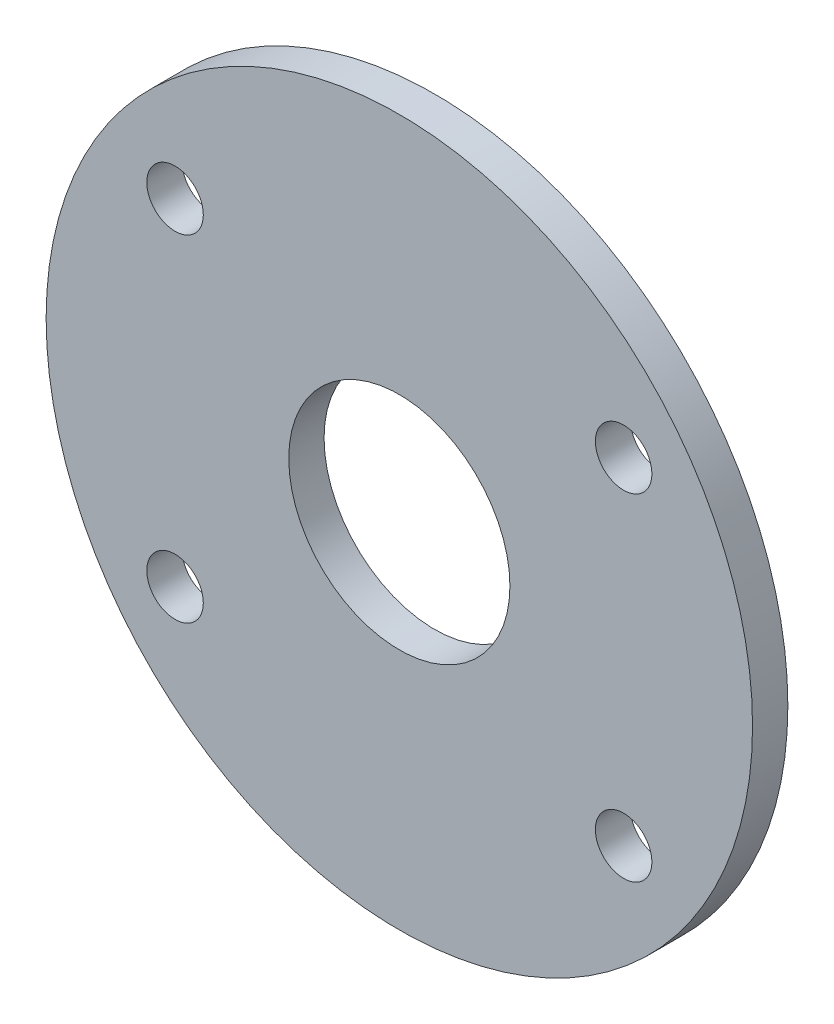
ISO-10303-21;
HEADER;
FILE_DESCRIPTION(('STEP AP214'),'2;1');
FILE_NAME('part.step','',(''),(''),'','','');
FILE_SCHEMA(('AUTOMOTIVE_DESIGN { 1 0 10303 214 1 1 1 1 }'));
ENDSEC;
DATA;
#1=APPLICATION_CONTEXT('core data for automotive mechanical design processes');
#2=APPLICATION_PROTOCOL_DEFINITION('international standard','automotive_design',2000,#1);
#3=PRODUCT_CONTEXT('',#1,'mechanical');
#4=PRODUCT('Part','Part','',(#3));
#5=PRODUCT_RELATED_PRODUCT_CATEGORY('part','',(#4));
#6=PRODUCT_DEFINITION_FORMATION('','',#4);
#7=PRODUCT_DEFINITION_CONTEXT('part definition',#1,'design');
#8=PRODUCT_DEFINITION('design','',#6,#7);
#9=PRODUCT_DEFINITION_SHAPE('','',#8);
#10=(LENGTH_UNIT() NAMED_UNIT(*) SI_UNIT(.MILLI.,.METRE.));
#11=(NAMED_UNIT(*) PLANE_ANGLE_UNIT() SI_UNIT($,.RADIAN.));
#12=(NAMED_UNIT(*) SI_UNIT($,.STERADIAN.) SOLID_ANGLE_UNIT());
#13=UNCERTAINTY_MEASURE_WITH_UNIT(LENGTH_MEASURE(1.E-05),#10,'distance_accuracy_value','');
#14=(GEOMETRIC_REPRESENTATION_CONTEXT(3) GLOBAL_UNCERTAINTY_ASSIGNED_CONTEXT((#13)) GLOBAL_UNIT_ASSIGNED_CONTEXT((#10,
#11,#12)) REPRESENTATION_CONTEXT('',''));
#15=CARTESIAN_POINT('',(0.,0.,0.));
#16=DIRECTION('',(0.,0.,1.));
#17=DIRECTION('',(1.,0.,0.));
#18=AXIS2_PLACEMENT_3D('',#15,#16,#17);
#19=CARTESIAN_POINT('',(-31.75,23.7916608289543,5.));
#20=DIRECTION('',(0.,0.,-1.));
#21=DIRECTION('',(-1.,0.,0.));
#22=AXIS2_PLACEMENT_3D('',#19,#20,#21);
#23=CYLINDRICAL_SURFACE('',#22,4.);
#24=CARTESIAN_POINT('',(-31.75,23.7916608289543,5.));
#25=DIRECTION('',(0.,0.,1.));
#26=DIRECTION('',(1.,0.,0.));
#27=AXIS2_PLACEMENT_3D('',#24,#25,#26);
#28=CIRCLE('',#27,4.);
#29=CARTESIAN_POINT('',(-27.75,23.7916608289543,5.));
#30=VERTEX_POINT('',#29);
#31=EDGE_CURVE('E54',#30,#30,#28,.T.);
#32=ORIENTED_EDGE('',*,*,#31,.T.);
#33=EDGE_LOOP('',(#32));
#34=FACE_BOUND('',#33,.T.);
#35=CARTESIAN_POINT('',(-31.75,23.7916608289543,0.));
#36=DIRECTION('',(0.,0.,1.));
#37=DIRECTION('',(1.,0.,0.));
#38=AXIS2_PLACEMENT_3D('',#35,#36,#37);
#39=CIRCLE('',#38,4.);
#40=CARTESIAN_POINT('',(-27.75,23.7916608289543,0.));
#41=VERTEX_POINT('',#40);
#42=EDGE_CURVE('E76',#41,#41,#39,.T.);
#43=ORIENTED_EDGE('',*,*,#42,.F.);
#44=EDGE_LOOP('',(#43));
#45=FACE_BOUND('',#44,.T.);
#46=ADVANCED_FACE('F45',(#34,#45),#23,.F.);
#47=CARTESIAN_POINT('',(31.75,23.7916608289543,5.));
#48=DIRECTION('',(0.,0.,-1.));
#49=DIRECTION('',(-1.,0.,0.));
#50=AXIS2_PLACEMENT_3D('',#47,#48,#49);
#51=CYLINDRICAL_SURFACE('',#50,4.);
#52=CARTESIAN_POINT('',(31.75,23.7916608289543,5.));
#53=DIRECTION('',(0.,0.,1.));
#54=DIRECTION('',(1.,0.,0.));
#55=AXIS2_PLACEMENT_3D('',#52,#53,#54);
#56=CIRCLE('',#55,4.);
#57=CARTESIAN_POINT('',(35.75,23.7916608289543,5.));
#58=VERTEX_POINT('',#57);
#59=EDGE_CURVE('E60',#58,#58,#56,.T.);
#60=ORIENTED_EDGE('',*,*,#59,.T.);
#61=EDGE_LOOP('',(#60));
#62=FACE_BOUND('',#61,.T.);
#63=CARTESIAN_POINT('',(31.75,23.7916608289543,0.));
#64=DIRECTION('',(0.,0.,1.));
#65=DIRECTION('',(1.,0.,0.));
#66=AXIS2_PLACEMENT_3D('',#63,#64,#65);
#67=CIRCLE('',#66,4.);
#68=CARTESIAN_POINT('',(35.75,23.7916608289543,0.));
#69=VERTEX_POINT('',#68);
#70=EDGE_CURVE('E73',#69,#69,#67,.T.);
#71=ORIENTED_EDGE('',*,*,#70,.F.);
#72=EDGE_LOOP('',(#71));
#73=FACE_BOUND('',#72,.T.);
#74=ADVANCED_FACE('F101',(#62,#73),#51,.F.);
#75=CARTESIAN_POINT('',(-31.75,-23.7916608289543,5.));
#76=DIRECTION('',(0.,0.,-1.));
#77=DIRECTION('',(-1.,0.,0.));
#78=AXIS2_PLACEMENT_3D('',#75,#76,#77);
#79=CYLINDRICAL_SURFACE('',#78,4.);
#80=CARTESIAN_POINT('',(-31.75,-23.7916608289543,5.));
#81=DIRECTION('',(0.,0.,1.));
#82=DIRECTION('',(1.,0.,0.));
#83=AXIS2_PLACEMENT_3D('',#80,#81,#82);
#84=CIRCLE('',#83,4.);
#85=CARTESIAN_POINT('',(-27.75,-23.7916608289543,5.));
#86=VERTEX_POINT('',#85);
#87=EDGE_CURVE('E88',#86,#86,#84,.T.);
#88=ORIENTED_EDGE('',*,*,#87,.T.);
#89=EDGE_LOOP('',(#88));
#90=FACE_BOUND('',#89,.T.);
#91=CARTESIAN_POINT('',(-31.75,-23.7916608289543,0.));
#92=DIRECTION('',(0.,0.,1.));
#93=DIRECTION('',(1.,0.,0.));
#94=AXIS2_PLACEMENT_3D('',#91,#92,#93);
#95=CIRCLE('',#94,4.);
#96=CARTESIAN_POINT('',(-27.75,-23.7916608289543,0.));
#97=VERTEX_POINT('',#96);
#98=EDGE_CURVE('E68',#97,#97,#95,.T.);
#99=ORIENTED_EDGE('',*,*,#98,.F.);
#100=EDGE_LOOP('',(#99));
#101=FACE_BOUND('',#100,.T.);
#102=ADVANCED_FACE('F119',(#90,#101),#79,.F.);
#103=CARTESIAN_POINT('',(31.75,-23.7916608289543,5.));
#104=DIRECTION('',(0.,0.,-1.));
#105=DIRECTION('',(-1.,0.,0.));
#106=AXIS2_PLACEMENT_3D('',#103,#104,#105);
#107=CYLINDRICAL_SURFACE('',#106,4.);
#108=CARTESIAN_POINT('',(31.75,-23.7916608289543,5.));
#109=DIRECTION('',(0.,0.,1.));
#110=DIRECTION('',(1.,0.,0.));
#111=AXIS2_PLACEMENT_3D('',#108,#109,#110);
#112=CIRCLE('',#111,4.);
#113=CARTESIAN_POINT('',(35.75,-23.7916608289543,5.));
#114=VERTEX_POINT('',#113);
#115=EDGE_CURVE('E83',#114,#114,#112,.T.);
#116=ORIENTED_EDGE('',*,*,#115,.T.);
#117=EDGE_LOOP('',(#116));
#118=FACE_BOUND('',#117,.T.);
#119=CARTESIAN_POINT('',(31.75,-23.7916608289543,0.));
#120=DIRECTION('',(0.,0.,1.));
#121=DIRECTION('',(1.,0.,0.));
#122=AXIS2_PLACEMENT_3D('',#119,#120,#121);
#123=CIRCLE('',#122,4.);
#124=CARTESIAN_POINT('',(35.75,-23.7916608289543,0.));
#125=VERTEX_POINT('',#124);
#126=EDGE_CURVE('E64',#125,#125,#123,.T.);
#127=ORIENTED_EDGE('',*,*,#126,.F.);
#128=EDGE_LOOP('',(#127));
#129=FACE_BOUND('',#128,.T.);
#130=ADVANCED_FACE('F47',(#118,#129),#107,.F.);
#131=CARTESIAN_POINT('',(0.,0.,5.));
#132=DIRECTION('',(0.,0.,-1.));
#133=DIRECTION('',(-1.,0.,0.));
#134=AXIS2_PLACEMENT_3D('',#131,#132,#133);
#135=CYLINDRICAL_SURFACE('',#134,50.);
#136=CARTESIAN_POINT('',(0.,0.,5.));
#137=DIRECTION('',(0.,0.,1.));
#138=DIRECTION('',(1.,0.,0.));
#139=AXIS2_PLACEMENT_3D('',#136,#137,#138);
#140=CIRCLE('',#139,50.);
#141=CARTESIAN_POINT('',(50.,0.,5.));
#142=VERTEX_POINT('',#141);
#143=EDGE_CURVE('E10',#142,#142,#140,.T.);
#144=ORIENTED_EDGE('',*,*,#143,.F.);
#145=EDGE_LOOP('',(#144));
#146=FACE_BOUND('',#145,.T.);
#147=CARTESIAN_POINT('',(0.,0.,0.));
#148=DIRECTION('',(0.,0.,1.));
#149=DIRECTION('',(1.,0.,0.));
#150=AXIS2_PLACEMENT_3D('',#147,#148,#149);
#151=CIRCLE('',#150,50.);
#152=CARTESIAN_POINT('',(50.,0.,0.));
#153=VERTEX_POINT('',#152);
#154=EDGE_CURVE('E49',#153,#153,#151,.T.);
#155=ORIENTED_EDGE('',*,*,#154,.T.);
#156=EDGE_LOOP('',(#155));
#157=FACE_BOUND('',#156,.T.);
#158=ADVANCED_FACE('F108',(#146,#157),#135,.T.);
#159=CARTESIAN_POINT('',(0.,0.,5.));
#160=DIRECTION('',(0.,0.,1.));
#161=DIRECTION('',(1.,0.,0.));
#162=AXIS2_PLACEMENT_3D('',#159,#160,#161);
#163=PLANE('',#162);
#164=CARTESIAN_POINT('',(0.,0.,5.));
#165=DIRECTION('',(0.,0.,1.));
#166=DIRECTION('',(1.,0.,0.));
#167=AXIS2_PLACEMENT_3D('',#164,#165,#166);
#168=CIRCLE('',#167,15.655);
#169=CARTESIAN_POINT('',(15.655,0.,5.));
#170=VERTEX_POINT('',#169);
#171=EDGE_CURVE('E69',#170,#170,#168,.T.);
#172=ORIENTED_EDGE('',*,*,#171,.F.);
#173=EDGE_LOOP('',(#172));
#174=FACE_BOUND('',#173,.T.);
#175=ORIENTED_EDGE('',*,*,#115,.F.);
#176=EDGE_LOOP('',(#175));
#177=FACE_BOUND('',#176,.T.);
#178=ORIENTED_EDGE('',*,*,#87,.F.);
#179=EDGE_LOOP('',(#178));
#180=FACE_BOUND('',#179,.T.);
#181=ORIENTED_EDGE('',*,*,#59,.F.);
#182=EDGE_LOOP('',(#181));
#183=FACE_BOUND('',#182,.T.);
#184=ORIENTED_EDGE('',*,*,#31,.F.);
#185=EDGE_LOOP('',(#184));
#186=FACE_BOUND('',#185,.T.);
#187=ORIENTED_EDGE('',*,*,#143,.T.);
#188=EDGE_LOOP('',(#187));
#189=FACE_BOUND('',#188,.T.);
#190=ADVANCED_FACE('F104',(#174,#177,#180,#183,#186,#189),#163,.T.);
#191=CARTESIAN_POINT('',(0.,0.,0.));
#192=DIRECTION('',(0.,0.,1.));
#193=DIRECTION('',(1.,0.,0.));
#194=AXIS2_PLACEMENT_3D('',#191,#192,#193);
#195=PLANE('',#194);
#196=CARTESIAN_POINT('',(0.,0.,0.));
#197=DIRECTION('',(0.,0.,-1.));
#198=DIRECTION('',(-1.,0.,0.));
#199=AXIS2_PLACEMENT_3D('',#196,#197,#198);
#200=CIRCLE('',#199,15.655);
#201=CARTESIAN_POINT('',(-15.655,0.,0.));
#202=VERTEX_POINT('',#201);
#203=EDGE_CURVE('E146',#202,#202,#200,.T.);
#204=ORIENTED_EDGE('',*,*,#203,.F.);
#205=EDGE_LOOP('',(#204));
#206=FACE_BOUND('',#205,.T.);
#207=ORIENTED_EDGE('',*,*,#126,.T.);
#208=EDGE_LOOP('',(#207));
#209=FACE_BOUND('',#208,.T.);
#210=ORIENTED_EDGE('',*,*,#98,.T.);
#211=EDGE_LOOP('',(#210));
#212=FACE_BOUND('',#211,.T.);
#213=ORIENTED_EDGE('',*,*,#70,.T.);
#214=EDGE_LOOP('',(#213));
#215=FACE_BOUND('',#214,.T.);
#216=ORIENTED_EDGE('',*,*,#42,.T.);
#217=EDGE_LOOP('',(#216));
#218=FACE_BOUND('',#217,.T.);
#219=ORIENTED_EDGE('',*,*,#154,.F.);
#220=EDGE_LOOP('',(#219));
#221=FACE_BOUND('',#220,.T.);
#222=ADVANCED_FACE('F107',(#206,#209,#212,#215,#218,#221),#195,.F.);
#223=CARTESIAN_POINT('',(0.,0.,10.));
#224=DIRECTION('',(0.,0.,-1.));
#225=DIRECTION('',(-1.,0.,0.));
#226=AXIS2_PLACEMENT_3D('',#223,#224,#225);
#227=CYLINDRICAL_SURFACE('',#226,15.655);
#228=ORIENTED_EDGE('',*,*,#171,.T.);
#229=EDGE_LOOP('',(#228));
#230=FACE_BOUND('',#229,.T.);
#231=ORIENTED_EDGE('',*,*,#203,.T.);
#232=EDGE_LOOP('',(#231));
#233=FACE_BOUND('',#232,.T.);
#234=ADVANCED_FACE('F134',(#230,#233),#227,.F.);
#235=CLOSED_SHELL('',(#46,#74,#102,#130,#158,#190,#222,#234));
#236=MANIFOLD_SOLID_BREP('B2',#235);
#237=ADVANCED_BREP_SHAPE_REPRESENTATION('',(#18,#236),#14);
#238=SHAPE_DEFINITION_REPRESENTATION(#9,#237);
ENDSEC;
END-ISO-10303-21;
